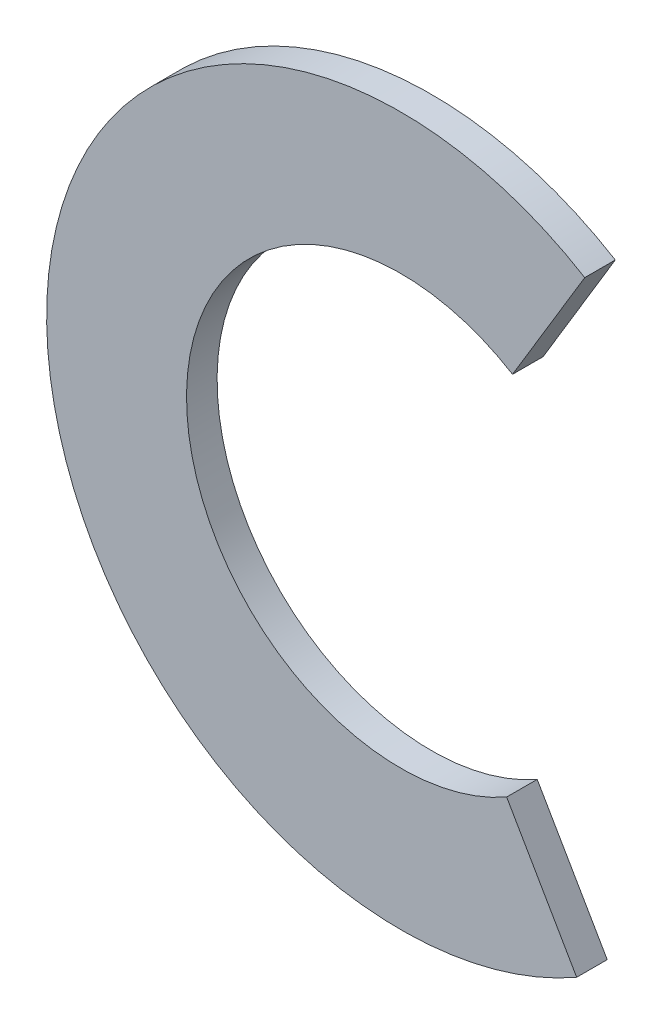
ISO-10303-21;
HEADER;
FILE_DESCRIPTION(('STEP AP214'),'2;1');
FILE_NAME('part.step','',(''),(''),'','','');
FILE_SCHEMA(('AUTOMOTIVE_DESIGN { 1 0 10303 214 1 1 1 1 }'));
ENDSEC;
DATA;
#1=APPLICATION_CONTEXT('core data for automotive mechanical design processes');
#2=APPLICATION_PROTOCOL_DEFINITION('international standard','automotive_design',2000,#1);
#3=PRODUCT_CONTEXT('',#1,'mechanical');
#4=PRODUCT('Part','Part','',(#3));
#5=PRODUCT_RELATED_PRODUCT_CATEGORY('part','',(#4));
#6=PRODUCT_DEFINITION_FORMATION('','',#4);
#7=PRODUCT_DEFINITION_CONTEXT('part definition',#1,'design');
#8=PRODUCT_DEFINITION('design','',#6,#7);
#9=PRODUCT_DEFINITION_SHAPE('','',#8);
#10=(LENGTH_UNIT() NAMED_UNIT(*) SI_UNIT(.MILLI.,.METRE.));
#11=(NAMED_UNIT(*) PLANE_ANGLE_UNIT() SI_UNIT($,.RADIAN.));
#12=(NAMED_UNIT(*) SI_UNIT($,.STERADIAN.) SOLID_ANGLE_UNIT());
#13=UNCERTAINTY_MEASURE_WITH_UNIT(LENGTH_MEASURE(1.E-05),#10,'distance_accuracy_value','');
#14=(GEOMETRIC_REPRESENTATION_CONTEXT(3) GLOBAL_UNCERTAINTY_ASSIGNED_CONTEXT((#13)) GLOBAL_UNIT_ASSIGNED_CONTEXT((#10,
#11,#12)) REPRESENTATION_CONTEXT('',''));
#15=CARTESIAN_POINT('',(0.,0.,0.));
#16=DIRECTION('',(0.,0.,1.));
#17=DIRECTION('',(1.,0.,0.));
#18=AXIS2_PLACEMENT_3D('',#15,#16,#17);
#19=CARTESIAN_POINT('',(0.,0.,0.));
#20=DIRECTION('',(0.,0.,1.));
#21=DIRECTION('',(1.,0.,0.));
#22=AXIS2_PLACEMENT_3D('',#19,#20,#21);
#23=PLANE('',#22);
#24=DIRECTION('',(0.515963587935798,0.856610515884797,0.));
#25=VECTOR('',#24,1.);
#26=CARTESIAN_POINT('',(1.154684,0.195072,0.));
#27=LINE('',#26,#25);
#28=CARTESIAN_POINT('',(1.15468399999999,0.195071999999986,0.));
#29=VERTEX_POINT('',#28);
#30=CARTESIAN_POINT('',(1.27279399999996,0.391159999999936,0.));
#31=VERTEX_POINT('',#30);
#32=EDGE_CURVE('E66',#29,#31,#27,.T.);
#33=ORIENTED_EDGE('',*,*,#32,.F.);
#34=CARTESIAN_POINT('',(0.9718044548182,-0.1039605402958,0.));
#35=DIRECTION('',(0.,0.,1.));
#36=DIRECTION('',(1.,0.,0.));
#37=AXIS2_PLACEMENT_3D('',#34,#35,#36);
#38=CIRCLE('',#37,0.3505215944869);
#39=CARTESIAN_POINT('',(1.145032,-0.408685999999994,0.));
#40=VERTEX_POINT('',#39);
#41=EDGE_CURVE('E20',#29,#40,#38,.T.);
#42=ORIENTED_EDGE('',*,*,#41,.T.);
#43=DIRECTION('',(-0.500554938956715,0.865704772475028,0.));
#44=VECTOR('',#43,1.);
#45=CARTESIAN_POINT('',(1.259586,-0.606806,0.));
#46=LINE('',#45,#44);
#47=CARTESIAN_POINT('',(1.259586,-0.606806000000004,0.));
#48=VERTEX_POINT('',#47);
#49=EDGE_CURVE('E64',#48,#40,#46,.T.);
#50=ORIENTED_EDGE('',*,*,#49,.F.);
#51=CARTESIAN_POINT('',(0.9718214904287,-0.1039270563763,0.));
#52=DIRECTION('',(0.,0.,1.));
#53=DIRECTION('',(1.,0.,0.));
#54=AXIS2_PLACEMENT_3D('',#51,#52,#53);
#55=CIRCLE('',#54,0.5793924791615);
#56=EDGE_CURVE('E67',#31,#48,#55,.T.);
#57=ORIENTED_EDGE('',*,*,#56,.F.);
#58=EDGE_LOOP('',(#33,#42,#50,#57));
#59=FACE_BOUND('',#58,.T.);
#60=ADVANCED_FACE('F17',(#59),#23,.F.);
#61=CARTESIAN_POINT('',(0.9718044548182,-0.1039605402958,0.));
#62=DIRECTION('',(0.,0.,1.));
#63=DIRECTION('',(1.,0.,0.));
#64=AXIS2_PLACEMENT_3D('',#61,#62,#63);
#65=CYLINDRICAL_SURFACE('',#64,0.3505215944869);
#66=CARTESIAN_POINT('',(0.9718044548182,-0.1039605402958,0.05));
#67=DIRECTION('',(0.,0.,1.));
#68=DIRECTION('',(1.,0.,0.));
#69=AXIS2_PLACEMENT_3D('',#66,#67,#68);
#70=CIRCLE('',#69,0.3505215944869);
#71=CARTESIAN_POINT('',(1.145032,-0.408685999999994,0.05));
#72=VERTEX_POINT('',#71);
#73=CARTESIAN_POINT('',(1.15468399999999,0.195071999999986,0.05));
#74=VERTEX_POINT('',#73);
#75=EDGE_CURVE('E84',#72,#74,#70,.F.);
#76=ORIENTED_EDGE('',*,*,#75,.F.);
#77=DIRECTION('',(0.,0.,1.));
#78=VECTOR('',#77,1.);
#79=CARTESIAN_POINT('',(1.145032,-0.408686,0.));
#80=LINE('',#79,#78);
#81=EDGE_CURVE('E62',#40,#72,#80,.T.);
#82=ORIENTED_EDGE('',*,*,#81,.F.);
#83=ORIENTED_EDGE('',*,*,#41,.F.);
#84=DIRECTION('',(0.,0.,1.));
#85=VECTOR('',#84,1.);
#86=CARTESIAN_POINT('',(1.154684,0.195072,0.));
#87=LINE('',#86,#85);
#88=EDGE_CURVE('E59',#74,#29,#87,.F.);
#89=ORIENTED_EDGE('',*,*,#88,.F.);
#90=EDGE_LOOP('',(#76,#82,#83,#89));
#91=FACE_BOUND('',#90,.T.);
#92=ADVANCED_FACE('F57',(#91),#65,.F.);
#93=CARTESIAN_POINT('',(1.154684,0.195072,0.));
#94=DIRECTION('',(0.856610515884797,-0.515963587935798,0.));
#95=DIRECTION('',(0.515963587935798,0.856610515884797,0.));
#96=AXIS2_PLACEMENT_3D('',#93,#94,#95);
#97=PLANE('',#96);
#98=ORIENTED_EDGE('',*,*,#88,.T.);
#99=ORIENTED_EDGE('',*,*,#32,.T.);
#100=DIRECTION('',(0.,0.,1.));
#101=VECTOR('',#100,1.);
#102=CARTESIAN_POINT('',(1.27279399999996,0.391159999999936,0.));
#103=LINE('',#102,#101);
#104=CARTESIAN_POINT('',(1.27279399999996,0.391159999999936,0.05));
#105=VERTEX_POINT('',#104);
#106=EDGE_CURVE('E70',#105,#31,#103,.F.);
#107=ORIENTED_EDGE('',*,*,#106,.F.);
#108=DIRECTION('',(0.515963587935793,0.8566105158848,0.));
#109=VECTOR('',#108,1.);
#110=CARTESIAN_POINT('',(1.154684,0.195072,0.05));
#111=LINE('',#110,#109);
#112=EDGE_CURVE('E74',#74,#105,#111,.T.);
#113=ORIENTED_EDGE('',*,*,#112,.F.);
#114=EDGE_LOOP('',(#98,#99,#107,#113));
#115=FACE_BOUND('',#114,.T.);
#116=ADVANCED_FACE('F72',(#115),#97,.T.);
#117=CARTESIAN_POINT('',(0.9718214904287,-0.1039270563763,0.));
#118=DIRECTION('',(0.,0.,1.));
#119=DIRECTION('',(1.,0.,0.));
#120=AXIS2_PLACEMENT_3D('',#117,#118,#119);
#121=CYLINDRICAL_SURFACE('',#120,0.5793924791615);
#122=ORIENTED_EDGE('',*,*,#106,.T.);
#123=ORIENTED_EDGE('',*,*,#56,.T.);
#124=DIRECTION('',(0.,0.,1.));
#125=VECTOR('',#124,1.);
#126=CARTESIAN_POINT('',(1.259586,-0.606806,0.));
#127=LINE('',#126,#125);
#128=CARTESIAN_POINT('',(1.259586,-0.606806000000004,0.05));
#129=VERTEX_POINT('',#128);
#130=EDGE_CURVE('E35',#129,#48,#127,.F.);
#131=ORIENTED_EDGE('',*,*,#130,.F.);
#132=CARTESIAN_POINT('',(0.9718214904287,-0.1039270563763,0.05));
#133=DIRECTION('',(0.,0.,1.));
#134=DIRECTION('',(1.,0.,0.));
#135=AXIS2_PLACEMENT_3D('',#132,#133,#134);
#136=CIRCLE('',#135,0.5793924791615);
#137=EDGE_CURVE('E26',#105,#129,#136,.T.);
#138=ORIENTED_EDGE('',*,*,#137,.F.);
#139=EDGE_LOOP('',(#122,#123,#131,#138));
#140=FACE_BOUND('',#139,.T.);
#141=ADVANCED_FACE('F85',(#140),#121,.T.);
#142=CARTESIAN_POINT('',(1.259586,-0.606806,0.));
#143=DIRECTION('',(0.865704772475027,0.500554938956716,0.));
#144=DIRECTION('',(-0.500554938956716,0.865704772475027,0.));
#145=AXIS2_PLACEMENT_3D('',#142,#143,#144);
#146=PLANE('',#145);
#147=ORIENTED_EDGE('',*,*,#130,.T.);
#148=ORIENTED_EDGE('',*,*,#49,.T.);
#149=ORIENTED_EDGE('',*,*,#81,.T.);
#150=DIRECTION('',(-0.500554938956715,0.865704772475028,0.));
#151=VECTOR('',#150,1.);
#152=CARTESIAN_POINT('',(1.259586,-0.606806,0.05));
#153=LINE('',#152,#151);
#154=EDGE_CURVE('E11',#129,#72,#153,.T.);
#155=ORIENTED_EDGE('',*,*,#154,.F.);
#156=EDGE_LOOP('',(#147,#148,#149,#155));
#157=FACE_BOUND('',#156,.T.);
#158=ADVANCED_FACE('F91',(#157),#146,.T.);
#159=CARTESIAN_POINT('',(0.,0.,0.05));
#160=DIRECTION('',(0.,0.,1.));
#161=DIRECTION('',(1.,0.,0.));
#162=AXIS2_PLACEMENT_3D('',#159,#160,#161);
#163=PLANE('',#162);
#164=ORIENTED_EDGE('',*,*,#137,.T.);
#165=ORIENTED_EDGE('',*,*,#154,.T.);
#166=ORIENTED_EDGE('',*,*,#75,.T.);
#167=ORIENTED_EDGE('',*,*,#112,.T.);
#168=EDGE_LOOP('',(#164,#165,#166,#167));
#169=FACE_BOUND('',#168,.T.);
#170=ADVANCED_FACE('F87',(#169),#163,.T.);
#171=CLOSED_SHELL('',(#60,#92,#116,#141,#158,#170));
#172=MANIFOLD_SOLID_BREP('B1',#171);
#173=ADVANCED_BREP_SHAPE_REPRESENTATION('',(#18,#172),#14);
#174=SHAPE_DEFINITION_REPRESENTATION(#9,#173);
ENDSEC;
END-ISO-10303-21;
